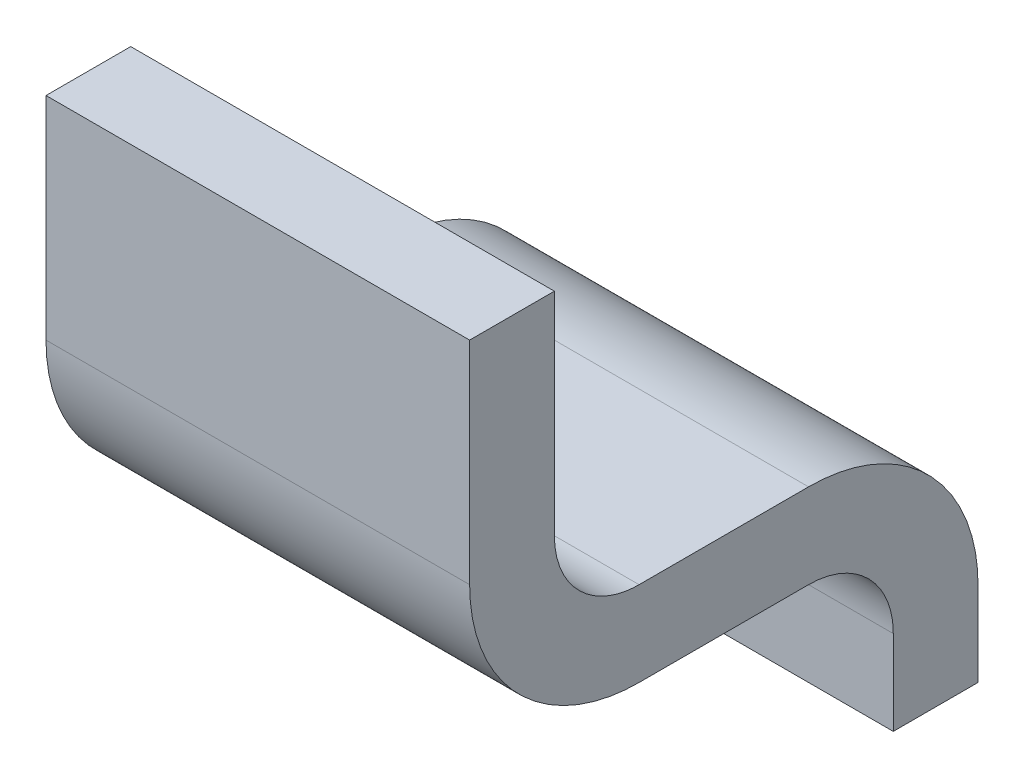
ISO-10303-21;
HEADER;
FILE_DESCRIPTION(('STEP AP214'),'2;1');
FILE_NAME('part.step','',(''),(''),'','','');
FILE_SCHEMA(('AUTOMOTIVE_DESIGN { 1 0 10303 214 1 1 1 1 }'));
ENDSEC;
DATA;
#1=APPLICATION_CONTEXT('core data for automotive mechanical design processes');
#2=APPLICATION_PROTOCOL_DEFINITION('international standard','automotive_design',2000,#1);
#3=PRODUCT_CONTEXT('',#1,'mechanical');
#4=PRODUCT('Part','Part','',(#3));
#5=PRODUCT_RELATED_PRODUCT_CATEGORY('part','',(#4));
#6=PRODUCT_DEFINITION_FORMATION('','',#4);
#7=PRODUCT_DEFINITION_CONTEXT('part definition',#1,'design');
#8=PRODUCT_DEFINITION('design','',#6,#7);
#9=PRODUCT_DEFINITION_SHAPE('','',#8);
#10=(LENGTH_UNIT() NAMED_UNIT(*) SI_UNIT(.MILLI.,.METRE.));
#11=(NAMED_UNIT(*) PLANE_ANGLE_UNIT() SI_UNIT($,.RADIAN.));
#12=(NAMED_UNIT(*) SI_UNIT($,.STERADIAN.) SOLID_ANGLE_UNIT());
#13=UNCERTAINTY_MEASURE_WITH_UNIT(LENGTH_MEASURE(1.E-05),#10,'distance_accuracy_value','');
#14=(GEOMETRIC_REPRESENTATION_CONTEXT(3) GLOBAL_UNCERTAINTY_ASSIGNED_CONTEXT((#13)) GLOBAL_UNIT_ASSIGNED_CONTEXT((#10,
#11,#12)) REPRESENTATION_CONTEXT('',''));
#15=CARTESIAN_POINT('',(0.,0.,0.));
#16=DIRECTION('',(0.,0.,1.));
#17=DIRECTION('',(1.,0.,0.));
#18=AXIS2_PLACEMENT_3D('',#15,#16,#17);
#19=CARTESIAN_POINT('',(-29.8028024029945,14.9309768194351,2.66031594000001));
#20=CARTESIAN_POINT('',(-30.4028024029945,14.9309767932082,2.66031594000001));
#21=CARTESIAN_POINT('',(-29.8028024029945,14.9309768194351,2.54031594000001));
#22=CARTESIAN_POINT('',(-30.4028024029945,14.9309767932082,2.54031594000001));
#23=(BOUNDED_SURFACE() B_SPLINE_SURFACE(1,1,((#19,#20),(#21,#22)),.UNSPECIFIED.,.F.,.F.,
.F.) B_SPLINE_SURFACE_WITH_KNOTS((2,2),(2,2),(-0.00011,1.E-05),(-0.00055,5.E-05),
.UNSPECIFIED.) GEOMETRIC_REPRESENTATION_ITEM() RATIONAL_B_SPLINE_SURFACE(((1.,1.),(1.,1.))) REPRESENTATION_ITEM('') SURFACE());
#24=CARTESIAN_POINT('',(-30.3528024029945,14.9309767953938,2.55031594000001));
#25=CARTESIAN_POINT('',(-30.3528024029945,14.9309767953938,2.65031594000001));
#26=(BOUNDED_CURVE() B_SPLINE_CURVE(1,(#24,#25),.UNSPECIFIED.,.F.,
.F.) B_SPLINE_CURVE_WITH_KNOTS((2,2),(-0.0001,0.),
.UNSPECIFIED.) CURVE() GEOMETRIC_REPRESENTATION_ITEM() RATIONAL_B_SPLINE_CURVE((1.,1.)) REPRESENTATION_ITEM(''));
#27=CARTESIAN_POINT('',(-30.3528024029945,14.9309767953938,2.55031594000001));
#28=VERTEX_POINT('',#27);
#29=CARTESIAN_POINT('',(-30.3528024029945,14.9309767953938,2.65031594000001));
#30=VERTEX_POINT('',#29);
#31=EDGE_CURVE('E113',#28,#30,#26,.T.);
#32=CARTESIAN_POINT('',(-30.3528024029945,14.9309767953938,2.65031594000001));
#33=CARTESIAN_POINT('',(-29.8528024029945,14.9309768172495,2.65031594000001));
#34=(BOUNDED_CURVE() B_SPLINE_CURVE(1,(#32,#33),.UNSPECIFIED.,.F.,
.F.) B_SPLINE_CURVE_WITH_KNOTS((2,2),(-0.0005,0.),
.UNSPECIFIED.) CURVE() GEOMETRIC_REPRESENTATION_ITEM() RATIONAL_B_SPLINE_CURVE((1.,1.)) REPRESENTATION_ITEM(''));
#35=CARTESIAN_POINT('',(-29.8528024029945,14.9309768172495,2.65031594000001));
#36=VERTEX_POINT('',#35);
#37=EDGE_CURVE('E143',#30,#36,#34,.T.);
#38=CARTESIAN_POINT('',(-29.8528024029945,14.9309768172495,2.65031594000001));
#39=CARTESIAN_POINT('',(-29.8528024029945,14.9309768172495,2.55031594000001));
#40=(BOUNDED_CURVE() B_SPLINE_CURVE(1,(#38,#39),.UNSPECIFIED.,.F.,
.F.) B_SPLINE_CURVE_WITH_KNOTS((2,2),(-0.0001,0.),
.UNSPECIFIED.) CURVE() GEOMETRIC_REPRESENTATION_ITEM() RATIONAL_B_SPLINE_CURVE((1.,1.)) REPRESENTATION_ITEM(''));
#41=CARTESIAN_POINT('',(-29.8528024029945,14.9309768172495,2.55031594000001));
#42=VERTEX_POINT('',#41);
#43=EDGE_CURVE('E116',#36,#42,#40,.T.);
#44=CARTESIAN_POINT('',(-29.8528024029945,14.9309768172495,2.55031594000001));
#45=CARTESIAN_POINT('',(-30.3528024029945,14.9309767953938,2.55031594000001));
#46=(BOUNDED_CURVE() B_SPLINE_CURVE(1,(#44,#45),.UNSPECIFIED.,.F.,
.F.) B_SPLINE_CURVE_WITH_KNOTS((2,2),(-0.0005,0.),
.UNSPECIFIED.) CURVE() GEOMETRIC_REPRESENTATION_ITEM() RATIONAL_B_SPLINE_CURVE((1.,1.)) REPRESENTATION_ITEM(''));
#47=EDGE_CURVE('E11',#42,#28,#46,.T.);
#48=ORIENTED_EDGE('',*,*,#31,.T.);
#49=ORIENTED_EDGE('',*,*,#37,.T.);
#50=ORIENTED_EDGE('',*,*,#43,.T.);
#51=ORIENTED_EDGE('',*,*,#47,.T.);
#52=EDGE_LOOP('',(#48,#49,#50,#51));
#53=FACE_BOUND('',#52,.T.);
#54=ADVANCED_FACE('F17',(#53),#23,.T.);
#55=CARTESIAN_POINT('',(-30.4028024040873,14.9559767932082,2.55031594000001));
#56=CARTESIAN_POINT('',(-30.4028023909739,14.6559767932082,2.55031594000001));
#57=CARTESIAN_POINT('',(-29.8028024040873,14.9559768194351,2.55031594000001));
#58=CARTESIAN_POINT('',(-29.8028023909739,14.6559768194351,2.55031594000001));
#59=(BOUNDED_SURFACE() B_SPLINE_SURFACE(1,1,((#55,#56),(#57,#58)),.UNSPECIFIED.,.F.,.F.,
.F.) B_SPLINE_SURFACE_WITH_KNOTS((2,2),(2,2),(-0.00055,5.00000000000558E-05),
(-2.50000000000062E-05,0.000275),
.UNSPECIFIED.) GEOMETRIC_REPRESENTATION_ITEM() RATIONAL_B_SPLINE_SURFACE(((1.,1.),(1.,1.))) REPRESENTATION_ITEM('') SURFACE());
#60=CARTESIAN_POINT('',(-29.8528023920667,14.6809768172495,2.55031594000001));
#61=CARTESIAN_POINT('',(-30.3528023920667,14.6809767953938,2.55031594000001));
#62=(BOUNDED_CURVE() B_SPLINE_CURVE(1,(#60,#61),.UNSPECIFIED.,.F.,
.F.) B_SPLINE_CURVE_WITH_KNOTS((2,2),(-0.0005,0.),
.UNSPECIFIED.) CURVE() GEOMETRIC_REPRESENTATION_ITEM() RATIONAL_B_SPLINE_CURVE((1.,1.)) REPRESENTATION_ITEM(''));
#63=CARTESIAN_POINT('',(-29.8528023920667,14.6809768172495,2.55031594000001));
#64=VERTEX_POINT('',#63);
#65=CARTESIAN_POINT('',(-30.3528023920667,14.6809767953938,2.55031594000001));
#66=VERTEX_POINT('',#65);
#67=EDGE_CURVE('E31',#64,#66,#62,.T.);
#68=CARTESIAN_POINT('',(-30.3528024029945,14.9309767953938,2.55031594000001));
#69=CARTESIAN_POINT('',(-30.3528023920667,14.6809767953938,2.55031594000001));
#70=(BOUNDED_CURVE() B_SPLINE_CURVE(1,(#68,#69),.UNSPECIFIED.,.F.,
.F.) B_SPLINE_CURVE_WITH_KNOTS((2,2),(0.,0.00025),
.UNSPECIFIED.) CURVE() GEOMETRIC_REPRESENTATION_ITEM() RATIONAL_B_SPLINE_CURVE((1.,1.)) REPRESENTATION_ITEM(''));
#71=EDGE_CURVE('E125',#28,#66,#70,.T.);
#72=CARTESIAN_POINT('',(-29.8528024029945,14.9309768172495,2.55031594000001));
#73=CARTESIAN_POINT('',(-29.8528023920667,14.6809768172495,2.55031594000001));
#74=(BOUNDED_CURVE() B_SPLINE_CURVE(1,(#72,#73),.UNSPECIFIED.,.F.,
.F.) B_SPLINE_CURVE_WITH_KNOTS((2,2),(0.,0.00025),
.UNSPECIFIED.) CURVE() GEOMETRIC_REPRESENTATION_ITEM() RATIONAL_B_SPLINE_CURVE((1.,1.)) REPRESENTATION_ITEM(''));
#75=EDGE_CURVE('E239',#42,#64,#74,.T.);
#76=ORIENTED_EDGE('',*,*,#67,.T.);
#77=ORIENTED_EDGE('',*,*,#71,.F.);
#78=ORIENTED_EDGE('',*,*,#47,.F.);
#79=ORIENTED_EDGE('',*,*,#75,.T.);
#80=EDGE_LOOP('',(#76,#77,#78,#79));
#81=FACE_BOUND('',#80,.T.);
#82=ADVANCED_FACE('F131',(#81),#59,.T.);
#83=CARTESIAN_POINT('',(-30.3528023920667,14.6809767953938,2.55031594000001));
#84=CARTESIAN_POINT('',(-30.3528023876956,14.5809767953938,2.55031594000001));
#85=CARTESIAN_POINT('',(-30.3528023876956,14.5809767953938,2.45031594000001));
#86=CARTESIAN_POINT('',(-29.8528023920667,14.6809768172495,2.55031594000001));
#87=CARTESIAN_POINT('',(-29.8528023876956,14.5809768172495,2.55031594000001));
#88=CARTESIAN_POINT('',(-29.8528023876956,14.5809768172495,2.45031594000001));
#89=(BOUNDED_SURFACE() B_SPLINE_SURFACE(1,2,((#83,#84,#85),(#86,#87,#88)),.UNSPECIFIED.,.F.,.F.,
.F.) B_SPLINE_SURFACE_WITH_KNOTS((2,2),(3,3),(0.,5.),(-3.14159265358979,-1.5707963267949),
.UNSPECIFIED.) GEOMETRIC_REPRESENTATION_ITEM() RATIONAL_B_SPLINE_SURFACE(((1.,0.707106781186548,
1.),(1.,0.707106781186548,1.))) REPRESENTATION_ITEM('') SURFACE());
#90=CARTESIAN_POINT('',(-30.3528023876955,14.5809767953938,2.45031594000001));
#91=CARTESIAN_POINT('',(-29.8528023876956,14.5809768172495,2.45031594000001));
#92=(BOUNDED_CURVE() B_SPLINE_CURVE(1,(#90,#91),.UNSPECIFIED.,.F.,
.F.) B_SPLINE_CURVE_WITH_KNOTS((2,2),(0.,0.0004999999999999),
.UNSPECIFIED.) CURVE() GEOMETRIC_REPRESENTATION_ITEM() RATIONAL_B_SPLINE_CURVE((1.,1.)) REPRESENTATION_ITEM(''));
#93=CARTESIAN_POINT('',(-30.3528023876955,14.5809767953938,2.45031594000001));
#94=VERTEX_POINT('',#93);
#95=CARTESIAN_POINT('',(-29.8528023876956,14.5809768172495,2.45031594000001));
#96=VERTEX_POINT('',#95);
#97=EDGE_CURVE('E240',#94,#96,#92,.T.);
#98=CARTESIAN_POINT('',(-30.3528023920667,14.6809767953938,2.55031594000001));
#99=CARTESIAN_POINT('',(-30.3528023876956,14.5809767953938,2.55031594000001));
#100=CARTESIAN_POINT('',(-30.3528023876956,14.5809767953938,2.45031594000001));
#101=(BOUNDED_CURVE() B_SPLINE_CURVE(2,(#98,#99,#100),.UNSPECIFIED.,.F.,
.F.) B_SPLINE_CURVE_WITH_KNOTS((3,3),(0.,1.5707963267949),
.UNSPECIFIED.) CURVE() GEOMETRIC_REPRESENTATION_ITEM() RATIONAL_B_SPLINE_CURVE((1.,
0.707106781186559,1.)) REPRESENTATION_ITEM(''));
#102=EDGE_CURVE('E134',#66,#94,#101,.T.);
#103=CARTESIAN_POINT('',(-29.8528023920667,14.6809768172495,2.55031594000001));
#104=CARTESIAN_POINT('',(-29.8528023876956,14.5809768172495,2.55031594000001));
#105=CARTESIAN_POINT('',(-29.8528023876956,14.5809768172495,2.45031594000001));
#106=(BOUNDED_CURVE() B_SPLINE_CURVE(2,(#103,#104,#105),.UNSPECIFIED.,.F.,
.F.) B_SPLINE_CURVE_WITH_KNOTS((3,3),(-3.14159265358979,-1.5707963267949),
.UNSPECIFIED.) CURVE() GEOMETRIC_REPRESENTATION_ITEM() RATIONAL_B_SPLINE_CURVE((1.,
0.707106781186559,1.)) REPRESENTATION_ITEM(''));
#107=EDGE_CURVE('E255',#64,#96,#106,.T.);
#108=ORIENTED_EDGE('',*,*,#97,.F.);
#109=ORIENTED_EDGE('',*,*,#102,.F.);
#110=ORIENTED_EDGE('',*,*,#67,.F.);
#111=ORIENTED_EDGE('',*,*,#107,.T.);
#112=EDGE_LOOP('',(#108,#109,#110,#111));
#113=FACE_BOUND('',#112,.T.);
#114=ADVANCED_FACE('F19',(#113),#89,.T.);
#115=CARTESIAN_POINT('',(-30.4028023876955,14.5809767932082,2.47031594000001));
#116=CARTESIAN_POINT('',(-30.4028023876955,14.5809767932082,2.23031594000001));
#117=CARTESIAN_POINT('',(-29.8028023876956,14.5809768194351,2.47031594000001));
#118=CARTESIAN_POINT('',(-29.8028023876956,14.5809768194351,2.23031594000001));
#119=(BOUNDED_SURFACE() B_SPLINE_SURFACE(1,1,((#115,#116),(#117,#118)),.UNSPECIFIED.,.F.,.F.,
.F.) B_SPLINE_SURFACE_WITH_KNOTS((2,2),(2,2),(-0.000549999999999891,4.999999999999E-05),
(-2.E-05,0.00022),.UNSPECIFIED.) GEOMETRIC_REPRESENTATION_ITEM() RATIONAL_B_SPLINE_SURFACE(((1.,
1.),(1.,1.))) REPRESENTATION_ITEM('') SURFACE());
#120=CARTESIAN_POINT('',(-29.8528023876956,14.5809768172495,2.25031594000001));
#121=CARTESIAN_POINT('',(-30.3528023876955,14.5809767953938,2.25031594000001));
#122=(BOUNDED_CURVE() B_SPLINE_CURVE(1,(#120,#121),.UNSPECIFIED.,.F.,
.F.) B_SPLINE_CURVE_WITH_KNOTS((2,2),(-0.0004999999999999,0.),
.UNSPECIFIED.) CURVE() GEOMETRIC_REPRESENTATION_ITEM() RATIONAL_B_SPLINE_CURVE((1.,1.)) REPRESENTATION_ITEM(''));
#123=CARTESIAN_POINT('',(-29.8528023876956,14.5809768172495,2.25031594000001));
#124=VERTEX_POINT('',#123);
#125=CARTESIAN_POINT('',(-30.3528023876955,14.5809767953938,2.25031594000001));
#126=VERTEX_POINT('',#125);
#127=EDGE_CURVE('E47',#124,#126,#122,.T.);
#128=CARTESIAN_POINT('',(-30.3528023876955,14.5809767953938,2.45031594000001));
#129=CARTESIAN_POINT('',(-30.3528023876955,14.5809767953938,2.25031594000001));
#130=(BOUNDED_CURVE() B_SPLINE_CURVE(1,(#128,#129),.UNSPECIFIED.,.F.,
.F.) B_SPLINE_CURVE_WITH_KNOTS((2,2),(0.0002,0.0004),
.UNSPECIFIED.) CURVE() GEOMETRIC_REPRESENTATION_ITEM() RATIONAL_B_SPLINE_CURVE((1.,1.)) REPRESENTATION_ITEM(''));
#131=EDGE_CURVE('E141',#94,#126,#130,.T.);
#132=CARTESIAN_POINT('',(-29.8528023876956,14.5809768172495,2.45031594000001));
#133=CARTESIAN_POINT('',(-29.8528023876956,14.5809768172495,2.25031594000001));
#134=(BOUNDED_CURVE() B_SPLINE_CURVE(1,(#132,#133),.UNSPECIFIED.,.F.,
.F.) B_SPLINE_CURVE_WITH_KNOTS((2,2),(0.,0.0002),
.UNSPECIFIED.) CURVE() GEOMETRIC_REPRESENTATION_ITEM() RATIONAL_B_SPLINE_CURVE((1.,1.)) REPRESENTATION_ITEM(''));
#135=EDGE_CURVE('E264',#96,#124,#134,.T.);
#136=ORIENTED_EDGE('',*,*,#127,.T.);
#137=ORIENTED_EDGE('',*,*,#131,.F.);
#138=ORIENTED_EDGE('',*,*,#97,.T.);
#139=ORIENTED_EDGE('',*,*,#135,.T.);
#140=EDGE_LOOP('',(#136,#137,#138,#139));
#141=FACE_BOUND('',#140,.T.);
#142=ADVANCED_FACE('F433',(#141),#119,.T.);
#143=CARTESIAN_POINT('',(-30.3528023876955,14.5809767953938,2.25031594000001));
#144=CARTESIAN_POINT('',(-30.3528023876955,14.5809767953938,2.05031594000001));
#145=CARTESIAN_POINT('',(-30.3528023789532,14.3809767953938,2.05031594000001));
#146=CARTESIAN_POINT('',(-29.8528023876956,14.5809768172495,2.25031594000001));
#147=CARTESIAN_POINT('',(-29.8528023876956,14.5809768172495,2.05031594000001));
#148=CARTESIAN_POINT('',(-29.8528023789533,14.3809768172495,2.05031594000001));
#149=(BOUNDED_SURFACE() B_SPLINE_SURFACE(1,2,((#143,#144,#145),(#146,#147,#148)),.UNSPECIFIED.,
.F.,.F.,.F.) B_SPLINE_SURFACE_WITH_KNOTS((2,2),(3,3),(-2.49999999999952,1.12798659301916E-13),
(-1.5707963267949,0.),
.UNSPECIFIED.) GEOMETRIC_REPRESENTATION_ITEM() RATIONAL_B_SPLINE_SURFACE(((1.,0.707106781186546,
1.),(1.,0.707106781186546,1.))) REPRESENTATION_ITEM('') SURFACE());
#150=CARTESIAN_POINT('',(-29.8528023876956,14.5809768172495,2.25031594000001));
#151=CARTESIAN_POINT('',(-29.8528023876956,14.5809768172495,2.05031594000001));
#152=CARTESIAN_POINT('',(-29.8528023789533,14.3809768172495,2.05031594000001));
#153=(BOUNDED_CURVE() B_SPLINE_CURVE(2,(#150,#151,#152),.UNSPECIFIED.,.F.,
.F.) B_SPLINE_CURVE_WITH_KNOTS((3,3),(-1.5707963267949,0.),
.UNSPECIFIED.) CURVE() GEOMETRIC_REPRESENTATION_ITEM() RATIONAL_B_SPLINE_CURVE((1.,
0.707106781186556,1.)) REPRESENTATION_ITEM(''));
#154=CARTESIAN_POINT('',(-29.8528023789533,14.3809768172495,2.05031594000001));
#155=VERTEX_POINT('',#154);
#156=EDGE_CURVE('E281',#124,#155,#153,.T.);
#157=CARTESIAN_POINT('',(-29.8528023789533,14.3809768172495,2.05031594000001));
#158=CARTESIAN_POINT('',(-30.3528023789532,14.3809767953938,2.05031594000001));
#159=(BOUNDED_CURVE() B_SPLINE_CURVE(1,(#157,#158),.UNSPECIFIED.,.F.,
.F.) B_SPLINE_CURVE_WITH_KNOTS((2,2),(-0.0004999999999999,0.),
.UNSPECIFIED.) CURVE() GEOMETRIC_REPRESENTATION_ITEM() RATIONAL_B_SPLINE_CURVE((1.,1.)) REPRESENTATION_ITEM(''));
#160=CARTESIAN_POINT('',(-30.3528023789532,14.3809767953938,2.05031594000001));
#161=VERTEX_POINT('',#160);
#162=EDGE_CURVE('E39',#155,#161,#159,.T.);
#163=CARTESIAN_POINT('',(-30.3528023876955,14.5809767953938,2.25031594000001));
#164=CARTESIAN_POINT('',(-30.3528023876955,14.5809767953938,2.05031594000001));
#165=CARTESIAN_POINT('',(-30.3528023789532,14.3809767953938,2.05031594000001));
#166=(BOUNDED_CURVE() B_SPLINE_CURVE(2,(#163,#164,#165),.UNSPECIFIED.,.F.,
.F.) B_SPLINE_CURVE_WITH_KNOTS((3,3),(1.5707963267949,3.14159265358979),
.UNSPECIFIED.) CURVE() GEOMETRIC_REPRESENTATION_ITEM() RATIONAL_B_SPLINE_CURVE((1.,
0.707106781186556,1.)) REPRESENTATION_ITEM(''));
#167=EDGE_CURVE('E303',#126,#161,#166,.T.);
#168=ORIENTED_EDGE('',*,*,#156,.T.);
#169=ORIENTED_EDGE('',*,*,#162,.T.);
#170=ORIENTED_EDGE('',*,*,#167,.F.);
#171=ORIENTED_EDGE('',*,*,#127,.F.);
#172=EDGE_LOOP('',(#168,#169,#170,#171));
#173=FACE_BOUND('',#172,.T.);
#174=ADVANCED_FACE('F392',(#173),#149,.T.);
#175=CARTESIAN_POINT('',(-30.4028023793903,14.3909767932082,2.05031594000001));
#176=CARTESIAN_POINT('',(-30.402802374145,14.2709767932082,2.05031594000001));
#177=CARTESIAN_POINT('',(-29.8028023793904,14.3909768194351,2.05031594000001));
#178=CARTESIAN_POINT('',(-29.8028023741451,14.2709768194351,2.05031594000001));
#179=(BOUNDED_SURFACE() B_SPLINE_SURFACE(1,1,((#175,#176),(#177,#178)),.UNSPECIFIED.,.F.,.F.,
.F.) B_SPLINE_SURFACE_WITH_KNOTS((2,2),(2,2),(-0.000549999999999896,5.00000000000322E-05),
(-1.00000000000077E-05,0.000110000000000002),
.UNSPECIFIED.) GEOMETRIC_REPRESENTATION_ITEM() RATIONAL_B_SPLINE_SURFACE(((1.,1.),(1.,1.))) REPRESENTATION_ITEM('') SURFACE());
#180=CARTESIAN_POINT('',(-29.8528023745822,14.2809768172495,2.05031594000001));
#181=CARTESIAN_POINT('',(-30.3528023745821,14.2809767953938,2.05031594000001));
#182=(BOUNDED_CURVE() B_SPLINE_CURVE(1,(#180,#181),.UNSPECIFIED.,.F.,
.F.) B_SPLINE_CURVE_WITH_KNOTS((2,2),(-0.000499999999999896,0.),
.UNSPECIFIED.) CURVE() GEOMETRIC_REPRESENTATION_ITEM() RATIONAL_B_SPLINE_CURVE((1.,1.)) REPRESENTATION_ITEM(''));
#183=CARTESIAN_POINT('',(-29.8528023745822,14.2809768172495,2.05031594000001));
#184=VERTEX_POINT('',#183);
#185=CARTESIAN_POINT('',(-30.3528023745821,14.2809767953938,2.05031594000001));
#186=VERTEX_POINT('',#185);
#187=EDGE_CURVE('E203',#184,#186,#182,.T.);
#188=CARTESIAN_POINT('',(-30.3528023789532,14.3809767953938,2.05031594000001));
#189=CARTESIAN_POINT('',(-30.3528023745821,14.2809767953938,2.05031594000001));
#190=(BOUNDED_CURVE() B_SPLINE_CURVE(1,(#188,#189),.UNSPECIFIED.,.F.,
.F.) B_SPLINE_CURVE_WITH_KNOTS((2,2),(0.00055,0.00065),
.UNSPECIFIED.) CURVE() GEOMETRIC_REPRESENTATION_ITEM() RATIONAL_B_SPLINE_CURVE((1.,1.)) REPRESENTATION_ITEM(''));
#191=EDGE_CURVE('E129',#161,#186,#190,.T.);
#192=CARTESIAN_POINT('',(-29.8528023789533,14.3809768172495,2.05031594000001));
#193=CARTESIAN_POINT('',(-29.8528023745822,14.2809768172495,2.05031594000001));
#194=(BOUNDED_CURVE() B_SPLINE_CURVE(1,(#192,#193),.UNSPECIFIED.,.F.,
.F.) B_SPLINE_CURVE_WITH_KNOTS((2,2),(0.,0.0001),
.UNSPECIFIED.) CURVE() GEOMETRIC_REPRESENTATION_ITEM() RATIONAL_B_SPLINE_CURVE((1.,1.)) REPRESENTATION_ITEM(''));
#195=EDGE_CURVE('E220',#155,#184,#194,.T.);
#196=ORIENTED_EDGE('',*,*,#187,.T.);
#197=ORIENTED_EDGE('',*,*,#191,.F.);
#198=ORIENTED_EDGE('',*,*,#162,.F.);
#199=ORIENTED_EDGE('',*,*,#195,.T.);
#200=EDGE_LOOP('',(#196,#197,#198,#199));
#201=FACE_BOUND('',#200,.T.);
#202=ADVANCED_FACE('F390',(#201),#179,.T.);
#203=CARTESIAN_POINT('',(-30.3528024058357,14.9959767953938,2.71031594000001));
#204=CARTESIAN_POINT('',(-30.3528023717409,14.2159767953938,2.71031594000001));
#205=CARTESIAN_POINT('',(-30.3528024058357,14.9959767953938,1.99031594000001));
#206=CARTESIAN_POINT('',(-30.3528023717409,14.2159767953938,1.99031594000001));
#207=(BOUNDED_SURFACE() B_SPLINE_SURFACE(1,1,((#203,#204),(#205,#206)),.UNSPECIFIED.,.F.,.F.,
.F.) B_SPLINE_SURFACE_WITH_KNOTS((2,2),(2,2),(-0.00066,6.E-05),(-6.5E-05,0.000715),
.UNSPECIFIED.) GEOMETRIC_REPRESENTATION_ITEM() RATIONAL_B_SPLINE_SURFACE(((1.,1.),(1.,1.))) REPRESENTATION_ITEM('') SURFACE());
#208=CARTESIAN_POINT('',(-30.3528023745821,14.2809767953938,2.05031594000001));
#209=CARTESIAN_POINT('',(-30.3528023745821,14.2809767953938,2.15031594000001));
#210=(BOUNDED_CURVE() B_SPLINE_CURVE(1,(#208,#209),.UNSPECIFIED.,.F.,
.F.) B_SPLINE_CURVE_WITH_KNOTS((2,2),(-0.0006,-0.0005),
.UNSPECIFIED.) CURVE() GEOMETRIC_REPRESENTATION_ITEM() RATIONAL_B_SPLINE_CURVE((1.,1.)) REPRESENTATION_ITEM(''));
#211=CARTESIAN_POINT('',(-30.3528023745821,14.2809767953938,2.15031594000001));
#212=VERTEX_POINT('',#211);
#213=EDGE_CURVE('E176',#186,#212,#210,.T.);
#214=CARTESIAN_POINT('',(-30.3528023789532,14.3809767953938,2.15031594000001));
#215=CARTESIAN_POINT('',(-30.3528023745821,14.2809767953938,2.15031594000001));
#216=(BOUNDED_CURVE() B_SPLINE_CURVE(1,(#214,#215),.UNSPECIFIED.,.F.,
.F.) B_SPLINE_CURVE_WITH_KNOTS((2,2),(0.,0.0001),
.UNSPECIFIED.) CURVE() GEOMETRIC_REPRESENTATION_ITEM() RATIONAL_B_SPLINE_CURVE((1.,1.)) REPRESENTATION_ITEM(''));
#217=CARTESIAN_POINT('',(-30.3528023789532,14.3809767953938,2.15031594000001));
#218=VERTEX_POINT('',#217);
#219=EDGE_CURVE('E222',#218,#212,#216,.T.);
#220=CARTESIAN_POINT('',(-30.3528023833243,14.4809767953938,2.25031594000001));
#221=CARTESIAN_POINT('',(-30.3528023833243,14.4809767953938,2.15031594000001));
#222=CARTESIAN_POINT('',(-30.3528023789532,14.3809767953938,2.15031594000001));
#223=(BOUNDED_CURVE() B_SPLINE_CURVE(2,(#220,#221,#222),.UNSPECIFIED.,.F.,
.F.) B_SPLINE_CURVE_WITH_KNOTS((3,3),(1.5707963267949,3.14159265358979),
.UNSPECIFIED.) CURVE() GEOMETRIC_REPRESENTATION_ITEM() RATIONAL_B_SPLINE_CURVE((1.,
0.707106781186554,1.)) REPRESENTATION_ITEM(''));
#224=CARTESIAN_POINT('',(-30.3528023833244,14.4809767953938,2.25031594000001));
#225=VERTEX_POINT('',#224);
#226=EDGE_CURVE('E165',#225,#218,#223,.T.);
#227=CARTESIAN_POINT('',(-30.3528023833244,14.4809767953938,2.45031594000001));
#228=CARTESIAN_POINT('',(-30.3528023833244,14.4809767953938,2.25031594000001));
#229=(BOUNDED_CURVE() B_SPLINE_CURVE(1,(#227,#228),.UNSPECIFIED.,.F.,
.F.) B_SPLINE_CURVE_WITH_KNOTS((2,2),(0.,0.0002),
.UNSPECIFIED.) CURVE() GEOMETRIC_REPRESENTATION_ITEM() RATIONAL_B_SPLINE_CURVE((1.,1.)) REPRESENTATION_ITEM(''));
#230=CARTESIAN_POINT('',(-30.3528023833244,14.4809767953938,2.45031594000001));
#231=VERTEX_POINT('',#230);
#232=EDGE_CURVE('E164',#231,#225,#229,.T.);
#233=CARTESIAN_POINT('',(-30.3528023920667,14.6809767953938,2.65031594000001));
#234=CARTESIAN_POINT('',(-30.3528023833244,14.4809767953938,2.65031594000001));
#235=CARTESIAN_POINT('',(-30.3528023833244,14.4809767953938,2.45031594000001));
#236=(BOUNDED_CURVE() B_SPLINE_CURVE(2,(#233,#234,#235),.UNSPECIFIED.,.F.,
.F.) B_SPLINE_CURVE_WITH_KNOTS((3,3),(0.,1.5707963267949),
.UNSPECIFIED.) CURVE() GEOMETRIC_REPRESENTATION_ITEM() RATIONAL_B_SPLINE_CURVE((1.,
0.707106781186552,1.)) REPRESENTATION_ITEM(''));
#237=CARTESIAN_POINT('',(-30.3528023920667,14.6809767953938,2.65031594000001));
#238=VERTEX_POINT('',#237);
#239=EDGE_CURVE('E177',#238,#231,#236,.T.);
#240=CARTESIAN_POINT('',(-30.3528024029945,14.9309767953938,2.65031594000001));
#241=CARTESIAN_POINT('',(-30.3528023920667,14.6809767953938,2.65031594000001));
#242=(BOUNDED_CURVE() B_SPLINE_CURVE(1,(#240,#241),.UNSPECIFIED.,.F.,
.F.) B_SPLINE_CURVE_WITH_KNOTS((2,2),(0.,0.00025),
.UNSPECIFIED.) CURVE() GEOMETRIC_REPRESENTATION_ITEM() RATIONAL_B_SPLINE_CURVE((1.,1.)) REPRESENTATION_ITEM(''));
#243=EDGE_CURVE('E23',#30,#238,#242,.T.);
#244=ORIENTED_EDGE('',*,*,#71,.T.);
#245=ORIENTED_EDGE('',*,*,#102,.T.);
#246=ORIENTED_EDGE('',*,*,#131,.T.);
#247=ORIENTED_EDGE('',*,*,#167,.T.);
#248=ORIENTED_EDGE('',*,*,#191,.T.);
#249=ORIENTED_EDGE('',*,*,#213,.T.);
#250=ORIENTED_EDGE('',*,*,#219,.F.);
#251=ORIENTED_EDGE('',*,*,#226,.F.);
#252=ORIENTED_EDGE('',*,*,#232,.F.);
#253=ORIENTED_EDGE('',*,*,#239,.F.);
#254=ORIENTED_EDGE('',*,*,#243,.F.);
#255=ORIENTED_EDGE('',*,*,#31,.F.);
#256=EDGE_LOOP('',(#244,#245,#246,#247,#248,#249,#250,#251,#252,#253,#254,#255));
#257=FACE_BOUND('',#256,.T.);
#258=ADVANCED_FACE('F123',(#257),#207,.T.);
#259=CARTESIAN_POINT('',(-29.8028023920666,14.9559768216206,2.65031594000001));
#260=CARTESIAN_POINT('',(-29.8028023789532,14.6559767953938,2.65031594000001));
#261=CARTESIAN_POINT('',(-30.4028024051801,14.9559767953938,2.65031594000001));
#262=CARTESIAN_POINT('',(-30.4028023920667,14.655976769167,2.65031594000001));
#263=(BOUNDED_SURFACE() B_SPLINE_SURFACE(1,1,((#259,#260),(#261,#262)),.UNSPECIFIED.,.F.,.F.,
.F.) B_SPLINE_SURFACE_WITH_KNOTS((2,2),(2,2),(-0.000550000001092839,5.00000120206348E-05),
(-2.50000021855711E-05,0.000275000024041272),
.UNSPECIFIED.) GEOMETRIC_REPRESENTATION_ITEM() RATIONAL_B_SPLINE_SURFACE(((1.,1.),(1.,1.))) REPRESENTATION_ITEM('') SURFACE());
#264=CARTESIAN_POINT('',(-30.3528023920667,14.6809767953938,2.65031594000001));
#265=CARTESIAN_POINT('',(-29.8528023920667,14.6809768172495,2.65031594000001));
#266=(BOUNDED_CURVE() B_SPLINE_CURVE(1,(#264,#265),.UNSPECIFIED.,.F.,
.F.) B_SPLINE_CURVE_WITH_KNOTS((2,2),(-0.0005,0.),
.UNSPECIFIED.) CURVE() GEOMETRIC_REPRESENTATION_ITEM() RATIONAL_B_SPLINE_CURVE((1.,1.)) REPRESENTATION_ITEM(''));
#267=CARTESIAN_POINT('',(-29.8528023920667,14.6809768172495,2.65031594000001));
#268=VERTEX_POINT('',#267);
#269=EDGE_CURVE('E185',#238,#268,#266,.T.);
#270=CARTESIAN_POINT('',(-29.8528024029945,14.9309768172495,2.65031594000001));
#271=CARTESIAN_POINT('',(-29.8528023920667,14.6809768172495,2.65031594000001));
#272=(BOUNDED_CURVE() B_SPLINE_CURVE(1,(#270,#271),.UNSPECIFIED.,.F.,
.F.) B_SPLINE_CURVE_WITH_KNOTS((2,2),(0.,0.00025),
.UNSPECIFIED.) CURVE() GEOMETRIC_REPRESENTATION_ITEM() RATIONAL_B_SPLINE_CURVE((1.,1.)) REPRESENTATION_ITEM(''));
#273=EDGE_CURVE('E166',#36,#268,#272,.T.);
#274=ORIENTED_EDGE('',*,*,#269,.T.);
#275=ORIENTED_EDGE('',*,*,#273,.F.);
#276=ORIENTED_EDGE('',*,*,#37,.F.);
#277=ORIENTED_EDGE('',*,*,#243,.T.);
#278=EDGE_LOOP('',(#274,#275,#276,#277));
#279=FACE_BOUND('',#278,.T.);
#280=ADVANCED_FACE('F561',(#279),#263,.T.);
#281=CARTESIAN_POINT('',(-29.8528023920667,14.6809768172495,2.65031594000001));
#282=CARTESIAN_POINT('',(-29.8528023833244,14.4809768172495,2.65031594000001));
#283=CARTESIAN_POINT('',(-29.8528023833244,14.4809768172495,2.45031594000001));
#284=CARTESIAN_POINT('',(-30.3528023920667,14.6809767953938,2.65031594000001));
#285=CARTESIAN_POINT('',(-30.3528023833244,14.4809767953938,2.65031594000001));
#286=CARTESIAN_POINT('',(-30.3528023833244,14.4809767953938,2.45031594000001));
#287=(BOUNDED_SURFACE() B_SPLINE_SURFACE(1,2,((#281,#282,#283),(#284,#285,#286)),.UNSPECIFIED.,
.F.,.F.,.F.) B_SPLINE_SURFACE_WITH_KNOTS((2,2),(3,3),(-2.5,1.12798659301916E-13),
(-3.14159265358979,-1.5707963267949),
.UNSPECIFIED.) GEOMETRIC_REPRESENTATION_ITEM() RATIONAL_B_SPLINE_SURFACE(((1.,0.707106781186548,
1.),(1.,0.707106781186548,1.))) REPRESENTATION_ITEM('') SURFACE());
#288=CARTESIAN_POINT('',(-30.3528023833244,14.4809767953938,2.45031594000001));
#289=CARTESIAN_POINT('',(-29.8528023833244,14.4809768172495,2.45031594000001));
#290=(BOUNDED_CURVE() B_SPLINE_CURVE(1,(#288,#289),.UNSPECIFIED.,.F.,
.F.) B_SPLINE_CURVE_WITH_KNOTS((2,2),(-0.0005,0.),
.UNSPECIFIED.) CURVE() GEOMETRIC_REPRESENTATION_ITEM() RATIONAL_B_SPLINE_CURVE((1.,1.)) REPRESENTATION_ITEM(''));
#291=CARTESIAN_POINT('',(-29.8528023833244,14.4809768172495,2.45031594000001));
#292=VERTEX_POINT('',#291);
#293=EDGE_CURVE('E156',#231,#292,#290,.T.);
#294=CARTESIAN_POINT('',(-29.8528023920667,14.6809768172495,2.65031594000001));
#295=CARTESIAN_POINT('',(-29.8528023833244,14.4809768172495,2.65031594000001));
#296=CARTESIAN_POINT('',(-29.8528023833244,14.4809768172495,2.45031594000001));
#297=(BOUNDED_CURVE() B_SPLINE_CURVE(2,(#294,#295,#296),.UNSPECIFIED.,.F.,
.F.) B_SPLINE_CURVE_WITH_KNOTS((3,3),(-3.14159265358979,-1.5707963267949),
.UNSPECIFIED.) CURVE() GEOMETRIC_REPRESENTATION_ITEM() RATIONAL_B_SPLINE_CURVE((1.,
0.707106781186552,1.)) REPRESENTATION_ITEM(''));
#298=EDGE_CURVE('E175',#268,#292,#297,.T.);
#299=ORIENTED_EDGE('',*,*,#239,.T.);
#300=ORIENTED_EDGE('',*,*,#293,.T.);
#301=ORIENTED_EDGE('',*,*,#298,.F.);
#302=ORIENTED_EDGE('',*,*,#269,.F.);
#303=EDGE_LOOP('',(#299,#300,#301,#302));
#304=FACE_BOUND('',#303,.T.);
#305=ADVANCED_FACE('F556',(#304),#287,.T.);
#306=CARTESIAN_POINT('',(-29.8028023833244,14.4809768194351,2.47031594000001));
#307=CARTESIAN_POINT('',(-29.8028023833244,14.4809768194351,2.23031594000001));
#308=CARTESIAN_POINT('',(-30.4028023833244,14.4809767932082,2.47031594000001));
#309=CARTESIAN_POINT('',(-30.4028023833244,14.4809767932082,2.23031594000001));
#310=(BOUNDED_SURFACE() B_SPLINE_SURFACE(1,1,((#306,#307),(#308,#309)),.UNSPECIFIED.,.F.,.F.,
.F.) B_SPLINE_SURFACE_WITH_KNOTS((2,2),(2,2),(-0.00055,5.E-05),(-2.E-05,0.00022),
.UNSPECIFIED.) GEOMETRIC_REPRESENTATION_ITEM() RATIONAL_B_SPLINE_SURFACE(((1.,1.),(1.,1.))) REPRESENTATION_ITEM('') SURFACE());
#311=CARTESIAN_POINT('',(-30.3528023833244,14.4809767953938,2.25031594000001));
#312=CARTESIAN_POINT('',(-29.8528023833244,14.4809768172495,2.25031594000001));
#313=(BOUNDED_CURVE() B_SPLINE_CURVE(1,(#311,#312),.UNSPECIFIED.,.F.,
.F.) B_SPLINE_CURVE_WITH_KNOTS((2,2),(-0.0005,0.),
.UNSPECIFIED.) CURVE() GEOMETRIC_REPRESENTATION_ITEM() RATIONAL_B_SPLINE_CURVE((1.,1.)) REPRESENTATION_ITEM(''));
#314=CARTESIAN_POINT('',(-29.8528023833244,14.4809768172495,2.25031594000001));
#315=VERTEX_POINT('',#314);
#316=EDGE_CURVE('E230',#225,#315,#313,.T.);
#317=CARTESIAN_POINT('',(-29.8528023833244,14.4809768172495,2.45031594000001));
#318=CARTESIAN_POINT('',(-29.8528023833244,14.4809768172495,2.25031594000001));
#319=(BOUNDED_CURVE() B_SPLINE_CURVE(1,(#317,#318),.UNSPECIFIED.,.F.,
.F.) B_SPLINE_CURVE_WITH_KNOTS((2,2),(0.0001,0.0003),
.UNSPECIFIED.) CURVE() GEOMETRIC_REPRESENTATION_ITEM() RATIONAL_B_SPLINE_CURVE((1.,1.)) REPRESENTATION_ITEM(''));
#320=EDGE_CURVE('E265',#292,#315,#319,.T.);
#321=ORIENTED_EDGE('',*,*,#316,.T.);
#322=ORIENTED_EDGE('',*,*,#320,.F.);
#323=ORIENTED_EDGE('',*,*,#293,.F.);
#324=ORIENTED_EDGE('',*,*,#232,.T.);
#325=EDGE_LOOP('',(#321,#322,#323,#324));
#326=FACE_BOUND('',#325,.T.);
#327=ADVANCED_FACE('F560',(#326),#310,.T.);
#328=CARTESIAN_POINT('',(-29.8528023833244,14.4809768172495,2.25031594000001));
#329=CARTESIAN_POINT('',(-29.8528023833244,14.4809768172495,2.15031594000001));
#330=CARTESIAN_POINT('',(-29.8528023789533,14.3809768172495,2.15031594000001));
#331=CARTESIAN_POINT('',(-30.3528023833244,14.4809767953938,2.25031594000001));
#332=CARTESIAN_POINT('',(-30.3528023833244,14.4809767953938,2.15031594000001));
#333=CARTESIAN_POINT('',(-30.3528023789533,14.3809767953938,2.15031594000001));
#334=(BOUNDED_SURFACE() B_SPLINE_SURFACE(1,2,((#328,#329,#330),(#331,#332,#333)),.UNSPECIFIED.,
.F.,.F.,.F.) B_SPLINE_SURFACE_WITH_KNOTS((2,2),(3,3),(-3.9778146934052E-13,4.99999999999963),
(-1.5707963267949,0.),
.UNSPECIFIED.) GEOMETRIC_REPRESENTATION_ITEM() RATIONAL_B_SPLINE_SURFACE(((1.,0.707106781186528,
1.),(1.,0.707106781186528,1.))) REPRESENTATION_ITEM('') SURFACE());
#335=CARTESIAN_POINT('',(-29.8528023789533,14.3809768172495,2.15031594000001));
#336=CARTESIAN_POINT('',(-30.3528023789532,14.3809767953938,2.15031594000001));
#337=(BOUNDED_CURVE() B_SPLINE_CURVE(1,(#335,#336),.UNSPECIFIED.,.F.,
.F.) B_SPLINE_CURVE_WITH_KNOTS((2,2),(0.,0.0004999999999999),
.UNSPECIFIED.) CURVE() GEOMETRIC_REPRESENTATION_ITEM() RATIONAL_B_SPLINE_CURVE((1.,1.)) REPRESENTATION_ITEM(''));
#338=CARTESIAN_POINT('',(-29.8528023789533,14.3809768172495,2.15031594000001));
#339=VERTEX_POINT('',#338);
#340=EDGE_CURVE('E231',#339,#218,#337,.T.);
#341=CARTESIAN_POINT('',(-29.8528023833244,14.4809768172495,2.25031594000001));
#342=CARTESIAN_POINT('',(-29.8528023833244,14.4809768172495,2.15031594000001));
#343=CARTESIAN_POINT('',(-29.8528023789533,14.3809768172495,2.15031594000001));
#344=(BOUNDED_CURVE() B_SPLINE_CURVE(2,(#341,#342,#343),.UNSPECIFIED.,.F.,
.F.) B_SPLINE_CURVE_WITH_KNOTS((3,3),(-1.5707963267949,0.),
.UNSPECIFIED.) CURVE() GEOMETRIC_REPRESENTATION_ITEM() RATIONAL_B_SPLINE_CURVE((1.,
0.707106781186554,1.)) REPRESENTATION_ITEM(''));
#345=EDGE_CURVE('E221',#315,#339,#344,.T.);
#346=ORIENTED_EDGE('',*,*,#340,.F.);
#347=ORIENTED_EDGE('',*,*,#345,.F.);
#348=ORIENTED_EDGE('',*,*,#316,.F.);
#349=ORIENTED_EDGE('',*,*,#226,.T.);
#350=EDGE_LOOP('',(#346,#347,#348,#349));
#351=FACE_BOUND('',#350,.T.);
#352=ADVANCED_FACE('F371',(#351),#334,.T.);
#353=CARTESIAN_POINT('',(-29.8028023745821,14.3909768216206,2.15031594000001));
#354=CARTESIAN_POINT('',(-29.8028023693367,14.2709767953938,2.15031594000001));
#355=CARTESIAN_POINT('',(-30.4028023798275,14.3909767953938,2.15031594000001));
#356=CARTESIAN_POINT('',(-30.4028023745821,14.270976769167,2.15031594000001));
#357=(BOUNDED_SURFACE() B_SPLINE_SURFACE(1,1,((#353,#354),(#355,#356)),.UNSPECIFIED.,.F.,.F.,
.F.) B_SPLINE_SURFACE_WITH_KNOTS((2,2),(2,2),(-0.00055000000043705,5.00000048083151E-05),
(-1.00000021855709E-05,0.000110000024041269),
.UNSPECIFIED.) GEOMETRIC_REPRESENTATION_ITEM() RATIONAL_B_SPLINE_SURFACE(((1.,1.),(1.,1.))) REPRESENTATION_ITEM('') SURFACE());
#358=CARTESIAN_POINT('',(-30.3528023745821,14.2809767953938,2.15031594000001));
#359=CARTESIAN_POINT('',(-29.8528023745822,14.2809768172495,2.15031594000001));
#360=(BOUNDED_CURVE() B_SPLINE_CURVE(1,(#358,#359),.UNSPECIFIED.,.F.,
.F.) B_SPLINE_CURVE_WITH_KNOTS((2,2),(-0.000499999999999896,0.),
.UNSPECIFIED.) CURVE() GEOMETRIC_REPRESENTATION_ITEM() RATIONAL_B_SPLINE_CURVE((1.,1.)) REPRESENTATION_ITEM(''));
#361=CARTESIAN_POINT('',(-29.8528023745822,14.2809768172495,2.15031594000001));
#362=VERTEX_POINT('',#361);
#363=EDGE_CURVE('E202',#212,#362,#360,.T.);
#364=CARTESIAN_POINT('',(-29.8528023789532,14.3809768172495,2.15031594000001));
#365=CARTESIAN_POINT('',(-29.8528023745821,14.2809768172495,2.15031594000001));
#366=(BOUNDED_CURVE() B_SPLINE_CURVE(1,(#364,#365),.UNSPECIFIED.,.F.,
.F.) B_SPLINE_CURVE_WITH_KNOTS((2,2),(0.00055,0.00065),
.UNSPECIFIED.) CURVE() GEOMETRIC_REPRESENTATION_ITEM() RATIONAL_B_SPLINE_CURVE((1.,1.)) REPRESENTATION_ITEM(''));
#367=EDGE_CURVE('E212',#339,#362,#366,.T.);
#368=ORIENTED_EDGE('',*,*,#363,.T.);
#369=ORIENTED_EDGE('',*,*,#367,.F.);
#370=ORIENTED_EDGE('',*,*,#340,.T.);
#371=ORIENTED_EDGE('',*,*,#219,.T.);
#372=EDGE_LOOP('',(#368,#369,#370,#371));
#373=FACE_BOUND('',#372,.T.);
#374=ADVANCED_FACE('F377',(#373),#357,.T.);
#375=CARTESIAN_POINT('',(-29.8528024058357,14.9959768172495,1.99031594000001));
#376=CARTESIAN_POINT('',(-29.8528023717409,14.2159768172495,1.99031594000001));
#377=CARTESIAN_POINT('',(-29.8528024058357,14.9959768172495,2.71031594000001));
#378=CARTESIAN_POINT('',(-29.8528023717409,14.2159768172495,2.71031594000001));
#379=(BOUNDED_SURFACE() B_SPLINE_SURFACE(1,1,((#375,#376),(#377,#378)),.UNSPECIFIED.,.F.,.F.,
.F.) B_SPLINE_SURFACE_WITH_KNOTS((2,2),(2,2),(-0.00016,0.00056),(-6.5E-05,0.000715),
.UNSPECIFIED.) GEOMETRIC_REPRESENTATION_ITEM() RATIONAL_B_SPLINE_SURFACE(((1.,1.),(1.,1.))) REPRESENTATION_ITEM('') SURFACE());
#380=CARTESIAN_POINT('',(-29.8528023745822,14.2809768172495,2.15031594000001));
#381=CARTESIAN_POINT('',(-29.8528023745822,14.2809768172495,2.05031594000001));
#382=(BOUNDED_CURVE() B_SPLINE_CURVE(1,(#380,#381),.UNSPECIFIED.,.F.,
.F.) B_SPLINE_CURVE_WITH_KNOTS((2,2),(0.0004,0.0005),
.UNSPECIFIED.) CURVE() GEOMETRIC_REPRESENTATION_ITEM() RATIONAL_B_SPLINE_CURVE((1.,1.)) REPRESENTATION_ITEM(''));
#383=EDGE_CURVE('E193',#362,#184,#382,.T.);
#384=ORIENTED_EDGE('',*,*,#273,.T.);
#385=ORIENTED_EDGE('',*,*,#298,.T.);
#386=ORIENTED_EDGE('',*,*,#320,.T.);
#387=ORIENTED_EDGE('',*,*,#345,.T.);
#388=ORIENTED_EDGE('',*,*,#367,.T.);
#389=ORIENTED_EDGE('',*,*,#383,.T.);
#390=ORIENTED_EDGE('',*,*,#195,.F.);
#391=ORIENTED_EDGE('',*,*,#156,.F.);
#392=ORIENTED_EDGE('',*,*,#135,.F.);
#393=ORIENTED_EDGE('',*,*,#107,.F.);
#394=ORIENTED_EDGE('',*,*,#75,.F.);
#395=ORIENTED_EDGE('',*,*,#43,.F.);
#396=EDGE_LOOP('',(#384,#385,#386,#387,#388,#389,#390,#391,#392,#393,#394,#395));
#397=FACE_BOUND('',#396,.T.);
#398=ADVANCED_FACE('F364',(#397),#379,.T.);
#399=CARTESIAN_POINT('',(-29.8028023745822,14.2809768194351,2.04031594000001));
#400=CARTESIAN_POINT('',(-30.4028023745821,14.2809767932082,2.04031594000001));
#401=CARTESIAN_POINT('',(-29.8028023745822,14.2809768194351,2.16031594000001));
#402=CARTESIAN_POINT('',(-30.4028023745821,14.2809767932082,2.16031594000001));
#403=(BOUNDED_SURFACE() B_SPLINE_SURFACE(1,1,((#399,#400),(#401,#402)),.UNSPECIFIED.,.F.,.F.,
.F.) B_SPLINE_SURFACE_WITH_KNOTS((2,2),(2,2),(-0.00011,1.E-05),(-0.000549999999999886,
4.99999999999897E-05),
.UNSPECIFIED.) GEOMETRIC_REPRESENTATION_ITEM() RATIONAL_B_SPLINE_SURFACE(((1.,1.),(1.,1.))) REPRESENTATION_ITEM('') SURFACE());
#404=ORIENTED_EDGE('',*,*,#187,.F.);
#405=ORIENTED_EDGE('',*,*,#383,.F.);
#406=ORIENTED_EDGE('',*,*,#363,.F.);
#407=ORIENTED_EDGE('',*,*,#213,.F.);
#408=EDGE_LOOP('',(#404,#405,#406,#407));
#409=FACE_BOUND('',#408,.T.);
#410=ADVANCED_FACE('F385',(#409),#403,.T.);
#411=CLOSED_SHELL('',(#54,#82,#114,#142,#174,#202,#258,#280,#305,#327,#352,#374,#398,#410));
#412=MANIFOLD_SOLID_BREP('B1',#411);
#413=ADVANCED_BREP_SHAPE_REPRESENTATION('',(#18,#412),#14);
#414=SHAPE_DEFINITION_REPRESENTATION(#9,#413);
ENDSEC;
END-ISO-10303-21;
